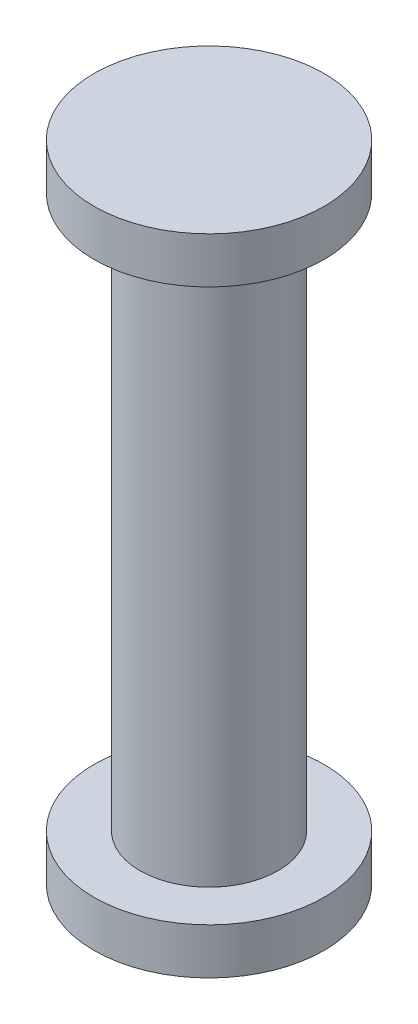
ISO-10303-21;
HEADER;
FILE_DESCRIPTION(('STEP AP214'),'2;1');
FILE_NAME('part.step','',(''),(''),'','','');
FILE_SCHEMA(('AUTOMOTIVE_DESIGN { 1 0 10303 214 1 1 1 1 }'));
ENDSEC;
DATA;
#1=APPLICATION_CONTEXT('core data for automotive mechanical design processes');
#2=APPLICATION_PROTOCOL_DEFINITION('international standard','automotive_design',2000,#1);
#3=PRODUCT_CONTEXT('',#1,'mechanical');
#4=PRODUCT('Part','Part','',(#3));
#5=PRODUCT_RELATED_PRODUCT_CATEGORY('part','',(#4));
#6=PRODUCT_DEFINITION_FORMATION('','',#4);
#7=PRODUCT_DEFINITION_CONTEXT('part definition',#1,'design');
#8=PRODUCT_DEFINITION('design','',#6,#7);
#9=PRODUCT_DEFINITION_SHAPE('','',#8);
#10=(LENGTH_UNIT() NAMED_UNIT(*) SI_UNIT(.MILLI.,.METRE.));
#11=(NAMED_UNIT(*) PLANE_ANGLE_UNIT() SI_UNIT($,.RADIAN.));
#12=(NAMED_UNIT(*) SI_UNIT($,.STERADIAN.) SOLID_ANGLE_UNIT());
#13=UNCERTAINTY_MEASURE_WITH_UNIT(LENGTH_MEASURE(1.E-05),#10,'distance_accuracy_value','');
#14=(GEOMETRIC_REPRESENTATION_CONTEXT(3) GLOBAL_UNCERTAINTY_ASSIGNED_CONTEXT((#13)) GLOBAL_UNIT_ASSIGNED_CONTEXT((#10,
#11,#12)) REPRESENTATION_CONTEXT('',''));
#15=CARTESIAN_POINT('',(0.,0.,0.));
#16=DIRECTION('',(0.,0.,1.));
#17=DIRECTION('',(1.,0.,0.));
#18=AXIS2_PLACEMENT_3D('',#15,#16,#17);
#19=CARTESIAN_POINT('',(0.,1.,0.));
#20=DIRECTION('',(0.,-1.,0.));
#21=DIRECTION('',(0.,0.,-1.));
#22=AXIS2_PLACEMENT_3D('',#19,#20,#21);
#23=CYLINDRICAL_SURFACE('',#22,2.5);
#24=CARTESIAN_POINT('',(0.,1.,0.));
#25=DIRECTION('',(0.,1.,0.));
#26=DIRECTION('',(0.,0.,1.));
#27=AXIS2_PLACEMENT_3D('',#24,#25,#26);
#28=CIRCLE('',#27,2.5);
#29=CARTESIAN_POINT('',(0.,1.,2.5));
#30=VERTEX_POINT('',#29);
#31=EDGE_CURVE('E44',#30,#30,#28,.T.);
#32=ORIENTED_EDGE('',*,*,#31,.F.);
#33=EDGE_LOOP('',(#32));
#34=FACE_BOUND('',#33,.T.);
#35=CARTESIAN_POINT('',(0.,0.,0.));
#36=DIRECTION('',(0.,1.,0.));
#37=DIRECTION('',(0.,0.,1.));
#38=AXIS2_PLACEMENT_3D('',#35,#36,#37);
#39=CIRCLE('',#38,2.5);
#40=CARTESIAN_POINT('',(0.,0.,2.5));
#41=VERTEX_POINT('',#40);
#42=EDGE_CURVE('E40',#41,#41,#39,.T.);
#43=ORIENTED_EDGE('',*,*,#42,.T.);
#44=EDGE_LOOP('',(#43));
#45=FACE_BOUND('',#44,.T.);
#46=ADVANCED_FACE('F37',(#34,#45),#23,.T.);
#47=CARTESIAN_POINT('',(0.,1.,0.));
#48=DIRECTION('',(0.,1.,0.));
#49=DIRECTION('',(0.,0.,1.));
#50=AXIS2_PLACEMENT_3D('',#47,#48,#49);
#51=PLANE('',#50);
#52=CARTESIAN_POINT('',(0.,1.,0.));
#53=DIRECTION('',(0.,1.,0.));
#54=DIRECTION('',(0.,0.,1.));
#55=AXIS2_PLACEMENT_3D('',#52,#53,#54);
#56=CIRCLE('',#55,1.5);
#57=CARTESIAN_POINT('',(0.,1.,1.5));
#58=VERTEX_POINT('',#57);
#59=EDGE_CURVE('E10',#58,#58,#56,.T.);
#60=ORIENTED_EDGE('',*,*,#59,.F.);
#61=EDGE_LOOP('',(#60));
#62=FACE_BOUND('',#61,.T.);
#63=ORIENTED_EDGE('',*,*,#31,.T.);
#64=EDGE_LOOP('',(#63));
#65=FACE_BOUND('',#64,.T.);
#66=ADVANCED_FACE('F78',(#62,#65),#51,.T.);
#67=CARTESIAN_POINT('',(0.,0.,0.));
#68=DIRECTION('',(0.,1.,0.));
#69=DIRECTION('',(0.,0.,1.));
#70=AXIS2_PLACEMENT_3D('',#67,#68,#69);
#71=PLANE('',#70);
#72=ORIENTED_EDGE('',*,*,#42,.F.);
#73=EDGE_LOOP('',(#72));
#74=FACE_BOUND('',#73,.T.);
#75=ADVANCED_FACE('F84',(#74),#71,.F.);
#76=CARTESIAN_POINT('',(0.,13.,0.));
#77=DIRECTION('',(0.,-1.,0.));
#78=DIRECTION('',(0.,0.,-1.));
#79=AXIS2_PLACEMENT_3D('',#76,#77,#78);
#80=CYLINDRICAL_SURFACE('',#79,1.5);
#81=CARTESIAN_POINT('',(0.,13.,0.));
#82=DIRECTION('',(0.,1.,0.));
#83=DIRECTION('',(0.,0.,1.));
#84=AXIS2_PLACEMENT_3D('',#81,#82,#83);
#85=CIRCLE('',#84,1.5);
#86=CARTESIAN_POINT('',(0.,13.,1.5));
#87=VERTEX_POINT('',#86);
#88=EDGE_CURVE('E50',#87,#87,#85,.T.);
#89=ORIENTED_EDGE('',*,*,#88,.F.);
#90=EDGE_LOOP('',(#89));
#91=FACE_BOUND('',#90,.T.);
#92=ORIENTED_EDGE('',*,*,#59,.T.);
#93=EDGE_LOOP('',(#92));
#94=FACE_BOUND('',#93,.T.);
#95=ADVANCED_FACE('F65',(#91,#94),#80,.T.);
#96=CARTESIAN_POINT('',(0.,14.,0.));
#97=DIRECTION('',(0.,-1.,0.));
#98=DIRECTION('',(0.,0.,-1.));
#99=AXIS2_PLACEMENT_3D('',#96,#97,#98);
#100=CYLINDRICAL_SURFACE('',#99,2.5);
#101=CARTESIAN_POINT('',(0.,14.,0.));
#102=DIRECTION('',(0.,1.,0.));
#103=DIRECTION('',(0.,0.,1.));
#104=AXIS2_PLACEMENT_3D('',#101,#102,#103);
#105=CIRCLE('',#104,2.5);
#106=CARTESIAN_POINT('',(0.,14.,2.5));
#107=VERTEX_POINT('',#106);
#108=EDGE_CURVE('E53',#107,#107,#105,.T.);
#109=ORIENTED_EDGE('',*,*,#108,.F.);
#110=EDGE_LOOP('',(#109));
#111=FACE_BOUND('',#110,.T.);
#112=CARTESIAN_POINT('',(0.,13.,0.));
#113=DIRECTION('',(0.,1.,0.));
#114=DIRECTION('',(0.,0.,1.));
#115=AXIS2_PLACEMENT_3D('',#112,#113,#114);
#116=CIRCLE('',#115,2.5);
#117=CARTESIAN_POINT('',(0.,13.,2.5));
#118=VERTEX_POINT('',#117);
#119=EDGE_CURVE('E54',#118,#118,#116,.T.);
#120=ORIENTED_EDGE('',*,*,#119,.T.);
#121=EDGE_LOOP('',(#120));
#122=FACE_BOUND('',#121,.T.);
#123=ADVANCED_FACE('F62',(#111,#122),#100,.T.);
#124=CARTESIAN_POINT('',(0.,14.,0.));
#125=DIRECTION('',(0.,1.,0.));
#126=DIRECTION('',(0.,0.,1.));
#127=AXIS2_PLACEMENT_3D('',#124,#125,#126);
#128=PLANE('',#127);
#129=ORIENTED_EDGE('',*,*,#108,.T.);
#130=EDGE_LOOP('',(#129));
#131=FACE_BOUND('',#130,.T.);
#132=ADVANCED_FACE('F60',(#131),#128,.T.);
#133=CARTESIAN_POINT('',(0.,13.,0.));
#134=DIRECTION('',(0.,1.,0.));
#135=DIRECTION('',(0.,0.,1.));
#136=AXIS2_PLACEMENT_3D('',#133,#134,#135);
#137=PLANE('',#136);
#138=ORIENTED_EDGE('',*,*,#88,.T.);
#139=EDGE_LOOP('',(#138));
#140=FACE_BOUND('',#139,.T.);
#141=ORIENTED_EDGE('',*,*,#119,.F.);
#142=EDGE_LOOP('',(#141));
#143=FACE_BOUND('',#142,.T.);
#144=ADVANCED_FACE('F69',(#140,#143),#137,.F.);
#145=CLOSED_SHELL('',(#46,#66,#75,#95,#123,#132,#144));
#146=MANIFOLD_SOLID_BREP('B2',#145);
#147=ADVANCED_BREP_SHAPE_REPRESENTATION('',(#18,#146),#14);
#148=SHAPE_DEFINITION_REPRESENTATION(#9,#147);
ENDSEC;
END-ISO-10303-21;
